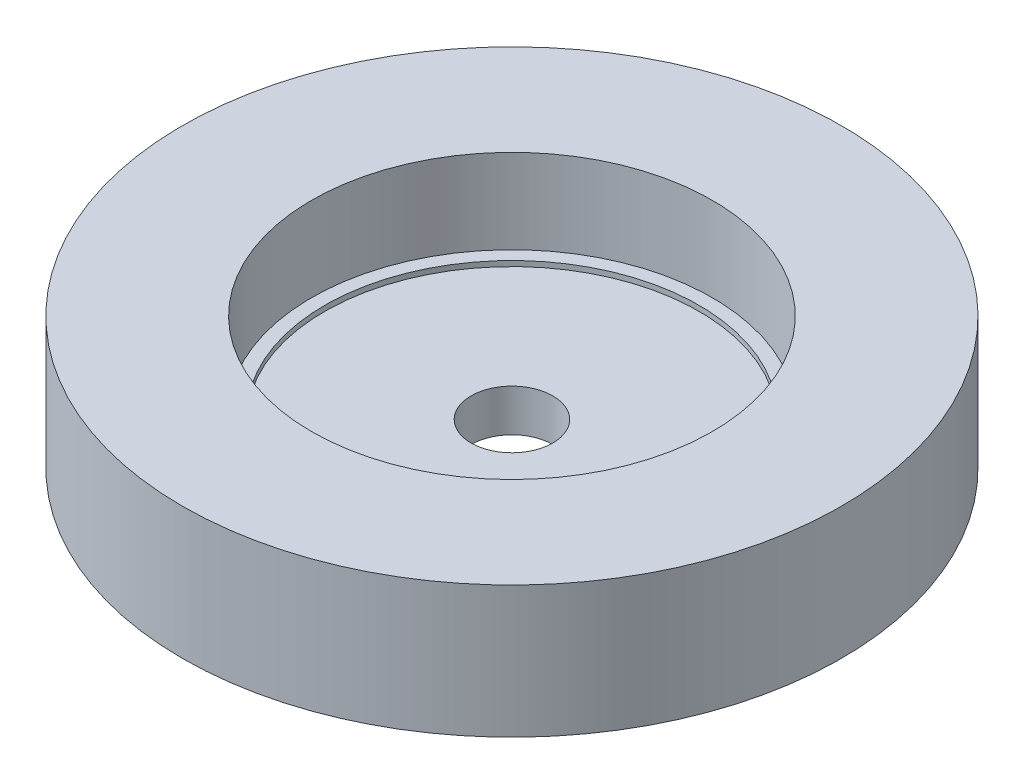
ISO-10303-21;
HEADER;
FILE_DESCRIPTION(('STEP AP214'),'2;1');
FILE_NAME('part.step','',(''),(''),'','','');
FILE_SCHEMA(('AUTOMOTIVE_DESIGN { 1 0 10303 214 1 1 1 1 }'));
ENDSEC;
DATA;
#1=APPLICATION_CONTEXT('core data for automotive mechanical design processes');
#2=APPLICATION_PROTOCOL_DEFINITION('international standard','automotive_design',2000,#1);
#3=PRODUCT_CONTEXT('',#1,'mechanical');
#4=PRODUCT('Part','Part','',(#3));
#5=PRODUCT_RELATED_PRODUCT_CATEGORY('part','',(#4));
#6=PRODUCT_DEFINITION_FORMATION('','',#4);
#7=PRODUCT_DEFINITION_CONTEXT('part definition',#1,'design');
#8=PRODUCT_DEFINITION('design','',#6,#7);
#9=PRODUCT_DEFINITION_SHAPE('','',#8);
#10=(LENGTH_UNIT() NAMED_UNIT(*) SI_UNIT(.MILLI.,.METRE.));
#11=(NAMED_UNIT(*) PLANE_ANGLE_UNIT() SI_UNIT($,.RADIAN.));
#12=(NAMED_UNIT(*) SI_UNIT($,.STERADIAN.) SOLID_ANGLE_UNIT());
#13=UNCERTAINTY_MEASURE_WITH_UNIT(LENGTH_MEASURE(1.E-05),#10,'distance_accuracy_value','');
#14=(GEOMETRIC_REPRESENTATION_CONTEXT(3) GLOBAL_UNCERTAINTY_ASSIGNED_CONTEXT((#13)) GLOBAL_UNIT_ASSIGNED_CONTEXT((#10,
#11,#12)) REPRESENTATION_CONTEXT('',''));
#15=CARTESIAN_POINT('',(0.,0.,0.));
#16=DIRECTION('',(0.,0.,1.));
#17=DIRECTION('',(1.,0.,0.));
#18=AXIS2_PLACEMENT_3D('',#15,#16,#17);
#19=CARTESIAN_POINT('',(0.,1.6,0.));
#20=DIRECTION('',(0.,-1.,0.));
#21=DIRECTION('',(0.,0.,-1.));
#22=AXIS2_PLACEMENT_3D('',#19,#20,#21);
#23=PLANE('',#22);
#24=CARTESIAN_POINT('',(0.,1.6,0.));
#25=DIRECTION('',(0.,-1.,0.));
#26=DIRECTION('',(0.,0.,-1.));
#27=AXIS2_PLACEMENT_3D('',#24,#25,#26);
#28=CIRCLE('',#27,1.55);
#29=CARTESIAN_POINT('',(0.,1.6,-1.55));
#30=VERTEX_POINT('',#29);
#31=EDGE_CURVE('E51',#30,#30,#28,.T.);
#32=ORIENTED_EDGE('',*,*,#31,.T.);
#33=EDGE_LOOP('',(#32));
#34=FACE_BOUND('',#33,.T.);
#35=CARTESIAN_POINT('',(0.,1.6,0.));
#36=DIRECTION('',(0.,1.,0.));
#37=DIRECTION('',(0.,0.,1.));
#38=AXIS2_PLACEMENT_3D('',#35,#36,#37);
#39=CIRCLE('',#38,7.1);
#40=CARTESIAN_POINT('',(0.,1.6,7.1));
#41=VERTEX_POINT('',#40);
#42=EDGE_CURVE('E58',#41,#41,#39,.T.);
#43=ORIENTED_EDGE('',*,*,#42,.T.);
#44=EDGE_LOOP('',(#43));
#45=FACE_BOUND('',#44,.T.);
#46=ADVANCED_FACE('F31',(#34,#45),#23,.F.);
#47=CARTESIAN_POINT('',(0.,5.,0.));
#48=DIRECTION('',(0.,-1.,0.));
#49=DIRECTION('',(0.,0.,-1.));
#50=AXIS2_PLACEMENT_3D('',#47,#48,#49);
#51=CYLINDRICAL_SURFACE('',#50,7.6);
#52=CARTESIAN_POINT('',(0.,1.8,0.));
#53=DIRECTION('',(0.,1.,0.));
#54=DIRECTION('',(0.,0.,1.));
#55=AXIS2_PLACEMENT_3D('',#52,#53,#54);
#56=CIRCLE('',#55,7.6);
#57=CARTESIAN_POINT('',(0.,1.8,7.6));
#58=VERTEX_POINT('',#57);
#59=EDGE_CURVE('E10',#58,#58,#56,.T.);
#60=ORIENTED_EDGE('',*,*,#59,.F.);
#61=EDGE_LOOP('',(#60));
#62=FACE_BOUND('',#61,.T.);
#63=CARTESIAN_POINT('',(0.,5.,0.));
#64=DIRECTION('',(0.,1.,0.));
#65=DIRECTION('',(0.,0.,1.));
#66=AXIS2_PLACEMENT_3D('',#63,#64,#65);
#67=CIRCLE('',#66,7.6);
#68=CARTESIAN_POINT('',(0.,5.,7.6));
#69=VERTEX_POINT('',#68);
#70=EDGE_CURVE('E47',#69,#69,#67,.T.);
#71=ORIENTED_EDGE('',*,*,#70,.T.);
#72=EDGE_LOOP('',(#71));
#73=FACE_BOUND('',#72,.T.);
#74=ADVANCED_FACE('F79',(#62,#73),#51,.F.);
#75=CARTESIAN_POINT('',(0.,5.,0.));
#76=DIRECTION('',(0.,1.,0.));
#77=DIRECTION('',(0.,0.,1.));
#78=AXIS2_PLACEMENT_3D('',#75,#76,#77);
#79=PLANE('',#78);
#80=CARTESIAN_POINT('',(0.,5.,0.));
#81=DIRECTION('',(0.,1.,0.));
#82=DIRECTION('',(0.,0.,1.));
#83=AXIS2_PLACEMENT_3D('',#80,#81,#82);
#84=CIRCLE('',#83,12.5);
#85=CARTESIAN_POINT('',(0.,5.,12.5));
#86=VERTEX_POINT('',#85);
#87=EDGE_CURVE('E38',#86,#86,#84,.T.);
#88=ORIENTED_EDGE('',*,*,#87,.T.);
#89=EDGE_LOOP('',(#88));
#90=FACE_BOUND('',#89,.T.);
#91=ORIENTED_EDGE('',*,*,#70,.F.);
#92=EDGE_LOOP('',(#91));
#93=FACE_BOUND('',#92,.T.);
#94=ADVANCED_FACE('F85',(#90,#93),#79,.T.);
#95=CARTESIAN_POINT('',(0.,0.,0.));
#96=DIRECTION('',(0.,1.,0.));
#97=DIRECTION('',(0.,0.,1.));
#98=AXIS2_PLACEMENT_3D('',#95,#96,#97);
#99=PLANE('',#98);
#100=CARTESIAN_POINT('',(0.,0.,0.));
#101=DIRECTION('',(0.,1.,0.));
#102=DIRECTION('',(0.,0.,1.));
#103=AXIS2_PLACEMENT_3D('',#100,#101,#102);
#104=CIRCLE('',#103,12.5);
#105=CARTESIAN_POINT('',(0.,0.,12.5));
#106=VERTEX_POINT('',#105);
#107=EDGE_CURVE('E42',#106,#106,#104,.T.);
#108=ORIENTED_EDGE('',*,*,#107,.F.);
#109=EDGE_LOOP('',(#108));
#110=FACE_BOUND('',#109,.T.);
#111=CARTESIAN_POINT('',(0.,0.,0.));
#112=DIRECTION('',(0.,-1.,0.));
#113=DIRECTION('',(0.,0.,-1.));
#114=AXIS2_PLACEMENT_3D('',#111,#112,#113);
#115=CIRCLE('',#114,1.55);
#116=CARTESIAN_POINT('',(0.,0.,-1.55));
#117=VERTEX_POINT('',#116);
#118=EDGE_CURVE('E52',#117,#117,#115,.T.);
#119=ORIENTED_EDGE('',*,*,#118,.F.);
#120=EDGE_LOOP('',(#119));
#121=FACE_BOUND('',#120,.T.);
#122=ADVANCED_FACE('F91',(#110,#121),#99,.F.);
#123=CARTESIAN_POINT('',(0.,5.,0.));
#124=DIRECTION('',(0.,-1.,0.));
#125=DIRECTION('',(0.,0.,-1.));
#126=AXIS2_PLACEMENT_3D('',#123,#124,#125);
#127=CYLINDRICAL_SURFACE('',#126,12.5);
#128=ORIENTED_EDGE('',*,*,#87,.F.);
#129=EDGE_LOOP('',(#128));
#130=FACE_BOUND('',#129,.T.);
#131=ORIENTED_EDGE('',*,*,#107,.T.);
#132=EDGE_LOOP('',(#131));
#133=FACE_BOUND('',#132,.T.);
#134=ADVANCED_FACE('F33',(#130,#133),#127,.T.);
#135=CARTESIAN_POINT('',(0.,1.6,0.));
#136=DIRECTION('',(0.,-1.,0.));
#137=DIRECTION('',(0.,0.,-1.));
#138=AXIS2_PLACEMENT_3D('',#135,#136,#137);
#139=CYLINDRICAL_SURFACE('',#138,1.55);
#140=ORIENTED_EDGE('',*,*,#31,.F.);
#141=EDGE_LOOP('',(#140));
#142=FACE_BOUND('',#141,.T.);
#143=ORIENTED_EDGE('',*,*,#118,.T.);
#144=EDGE_LOOP('',(#143));
#145=FACE_BOUND('',#144,.T.);
#146=ADVANCED_FACE('F69',(#142,#145),#139,.F.);
#147=CARTESIAN_POINT('',(0.,1.8,0.));
#148=DIRECTION('',(0.,1.,0.));
#149=DIRECTION('',(0.,0.,1.));
#150=AXIS2_PLACEMENT_3D('',#147,#148,#149);
#151=PLANE('',#150);
#152=ORIENTED_EDGE('',*,*,#59,.T.);
#153=EDGE_LOOP('',(#152));
#154=FACE_BOUND('',#153,.T.);
#155=CARTESIAN_POINT('',(0.,1.8,0.));
#156=DIRECTION('',(0.,1.,0.));
#157=DIRECTION('',(0.,0.,1.));
#158=AXIS2_PLACEMENT_3D('',#155,#156,#157);
#159=CIRCLE('',#158,7.1);
#160=CARTESIAN_POINT('',(0.,1.8,7.1));
#161=VERTEX_POINT('',#160);
#162=EDGE_CURVE('E55',#161,#161,#159,.T.);
#163=ORIENTED_EDGE('',*,*,#162,.F.);
#164=EDGE_LOOP('',(#163));
#165=FACE_BOUND('',#164,.T.);
#166=ADVANCED_FACE('F67',(#154,#165),#151,.T.);
#167=CARTESIAN_POINT('',(0.,1.8,0.));
#168=DIRECTION('',(0.,-1.,0.));
#169=DIRECTION('',(0.,0.,-1.));
#170=AXIS2_PLACEMENT_3D('',#167,#168,#169);
#171=CYLINDRICAL_SURFACE('',#170,7.1);
#172=ORIENTED_EDGE('',*,*,#162,.T.);
#173=EDGE_LOOP('',(#172));
#174=FACE_BOUND('',#173,.T.);
#175=ORIENTED_EDGE('',*,*,#42,.F.);
#176=EDGE_LOOP('',(#175));
#177=FACE_BOUND('',#176,.T.);
#178=ADVANCED_FACE('F64',(#174,#177),#171,.F.);
#179=CLOSED_SHELL('',(#46,#74,#94,#122,#134,#146,#166,#178));
#180=MANIFOLD_SOLID_BREP('B2',#179);
#181=ADVANCED_BREP_SHAPE_REPRESENTATION('',(#18,#180),#14);
#182=SHAPE_DEFINITION_REPRESENTATION(#9,#181);
ENDSEC;
END-ISO-10303-21;
